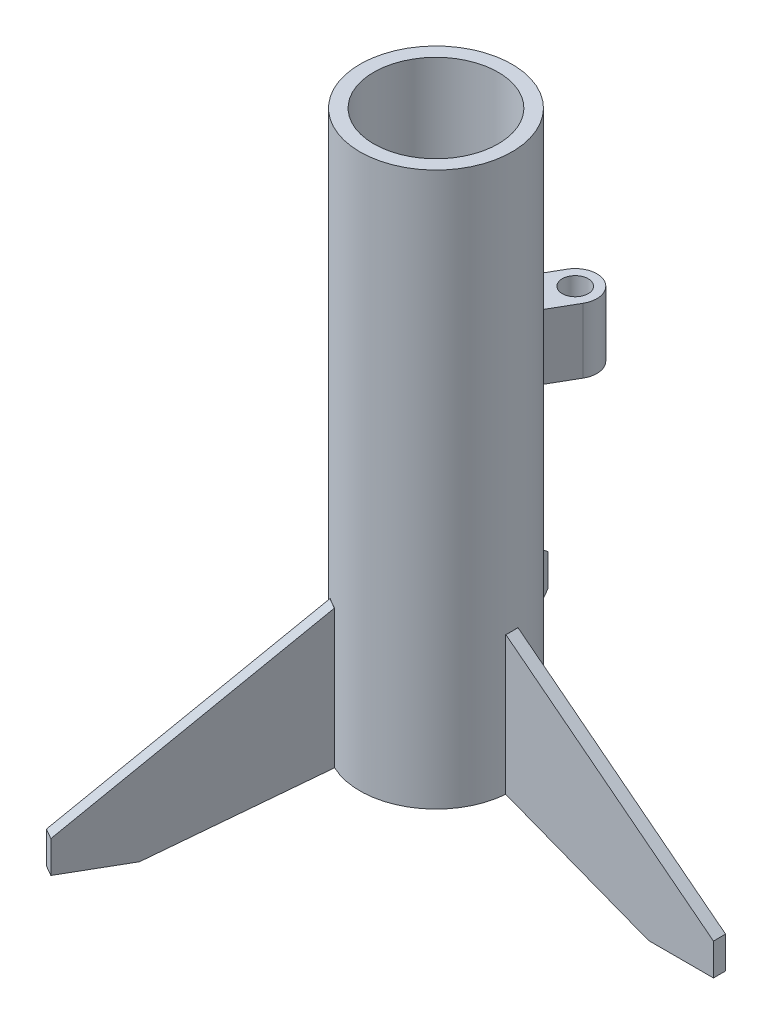
ISO-10303-21;
HEADER;
FILE_DESCRIPTION(('STEP AP214'),'2;1');
FILE_NAME('part.step','',(''),(''),'','','');
FILE_SCHEMA(('AUTOMOTIVE_DESIGN { 1 0 10303 214 1 1 1 1 }'));
ENDSEC;
DATA;
#1=APPLICATION_CONTEXT('core data for automotive mechanical design processes');
#2=APPLICATION_PROTOCOL_DEFINITION('international standard','automotive_design',2000,#1);
#3=PRODUCT_CONTEXT('',#1,'mechanical');
#4=PRODUCT('Part','Part','',(#3));
#5=PRODUCT_RELATED_PRODUCT_CATEGORY('part','',(#4));
#6=PRODUCT_DEFINITION_FORMATION('','',#4);
#7=PRODUCT_DEFINITION_CONTEXT('part definition',#1,'design');
#8=PRODUCT_DEFINITION('design','',#6,#7);
#9=PRODUCT_DEFINITION_SHAPE('','',#8);
#10=(LENGTH_UNIT() NAMED_UNIT(*) SI_UNIT(.MILLI.,.METRE.));
#11=(NAMED_UNIT(*) PLANE_ANGLE_UNIT() SI_UNIT($,.RADIAN.));
#12=(NAMED_UNIT(*) SI_UNIT($,.STERADIAN.) SOLID_ANGLE_UNIT());
#13=UNCERTAINTY_MEASURE_WITH_UNIT(LENGTH_MEASURE(1.E-05),#10,'distance_accuracy_value','');
#14=(GEOMETRIC_REPRESENTATION_CONTEXT(3) GLOBAL_UNCERTAINTY_ASSIGNED_CONTEXT((#13)) GLOBAL_UNIT_ASSIGNED_CONTEXT((#10,
#11,#12)) REPRESENTATION_CONTEXT('',''));
#15=CARTESIAN_POINT('',(0.,0.,0.));
#16=DIRECTION('',(0.,0.,1.));
#17=DIRECTION('',(1.,0.,0.));
#18=AXIS2_PLACEMENT_3D('',#15,#16,#17);
#19=CARTESIAN_POINT('',(0.,81.28,0.));
#20=DIRECTION('',(0.,-1.,0.));
#21=DIRECTION('',(0.,0.,-1.));
#22=AXIS2_PLACEMENT_3D('',#19,#20,#21);
#23=CYLINDRICAL_SURFACE('',#22,11.1633);
#24=DIRECTION('',(0.,-1.,0.));
#25=VECTOR('',#24,1.);
#26=CARTESIAN_POINT('',(-4.79402617542931,81.28,-10.0814969086589));
#27=LINE('',#26,#25);
#28=CARTESIAN_POINT('',(-4.79402617542931,20.32,-10.0814969086589));
#29=VERTEX_POINT('',#28);
#30=CARTESIAN_POINT('',(-4.79402617542932,0.,-10.0814969086589));
#31=VERTEX_POINT('',#30);
#32=EDGE_CURVE('E312',#29,#31,#27,.T.);
#33=ORIENTED_EDGE('',*,*,#32,.F.);
#34=CARTESIAN_POINT('',(0.,20.32,0.));
#35=DIRECTION('',(0.,-1.,0.));
#36=DIRECTION('',(0.,0.,-1.));
#37=AXIS2_PLACEMENT_3D('',#34,#35,#36);
#38=CIRCLE('',#37,11.1633);
#39=CARTESIAN_POINT('',(-5.58164999999991,20.32,-9.66770139006687));
#40=VERTEX_POINT('',#39);
#41=EDGE_CURVE('E306',#40,#29,#38,.T.);
#42=ORIENTED_EDGE('',*,*,#41,.F.);
#43=CARTESIAN_POINT('',(-6.33381934335805,20.32,-9.1924969086589));
#44=VERTEX_POINT('',#43);
#45=EDGE_CURVE('E308',#44,#40,#38,.T.);
#46=ORIENTED_EDGE('',*,*,#45,.F.);
#47=DIRECTION('',(0.,-1.,0.));
#48=VECTOR('',#47,1.);
#49=CARTESIAN_POINT('',(-6.33381934335805,81.28,-9.1924969086589));
#50=LINE('',#49,#48);
#51=CARTESIAN_POINT('',(-6.33381934335805,0.,-9.1924969086589));
#52=VERTEX_POINT('',#51);
#53=EDGE_CURVE('E309',#44,#52,#50,.T.);
#54=ORIENTED_EDGE('',*,*,#53,.T.);
#55=CARTESIAN_POINT('',(0.,0.,0.));
#56=DIRECTION('',(0.,1.,0.));
#57=DIRECTION('',(0.,0.,1.));
#58=AXIS2_PLACEMENT_3D('',#55,#56,#57);
#59=CIRCLE('',#58,11.1633);
#60=CARTESIAN_POINT('',(-6.33381934335818,0.,9.19249690865881));
#61=VERTEX_POINT('',#60);
#62=EDGE_CURVE('E430',#52,#61,#59,.T.);
#63=ORIENTED_EDGE('',*,*,#62,.T.);
#64=DIRECTION('',(0.,-1.,0.));
#65=VECTOR('',#64,1.);
#66=CARTESIAN_POINT('',(-6.33381934335818,81.28,9.19249690865881));
#67=LINE('',#66,#65);
#68=CARTESIAN_POINT('',(-6.33381934335818,20.32,9.19249690865881));
#69=VERTEX_POINT('',#68);
#70=EDGE_CURVE('E365',#69,#61,#67,.T.);
#71=ORIENTED_EDGE('',*,*,#70,.F.);
#72=CARTESIAN_POINT('',(0.,20.32,0.));
#73=DIRECTION('',(0.,-1.,0.));
#74=DIRECTION('',(0.,0.,-1.));
#75=AXIS2_PLACEMENT_3D('',#72,#73,#74);
#76=CIRCLE('',#75,11.1633);
#77=CARTESIAN_POINT('',(-5.58165000000005,20.32,9.6677013900668));
#78=VERTEX_POINT('',#77);
#79=EDGE_CURVE('E359',#78,#69,#76,.T.);
#80=ORIENTED_EDGE('',*,*,#79,.F.);
#81=CARTESIAN_POINT('',(-4.79402617542946,20.32,10.0814969086588));
#82=VERTEX_POINT('',#81);
#83=EDGE_CURVE('E361',#82,#78,#76,.T.);
#84=ORIENTED_EDGE('',*,*,#83,.F.);
#85=DIRECTION('',(0.,-1.,0.));
#86=VECTOR('',#85,1.);
#87=CARTESIAN_POINT('',(-4.79402617542946,81.28,10.0814969086588));
#88=LINE('',#87,#86);
#89=CARTESIAN_POINT('',(-4.79402617542945,0.,10.0814969086588));
#90=VERTEX_POINT('',#89);
#91=EDGE_CURVE('E362',#82,#90,#88,.T.);
#92=ORIENTED_EDGE('',*,*,#91,.T.);
#93=CARTESIAN_POINT('',(11.1278455187875,0.,0.889));
#94=VERTEX_POINT('',#93);
#95=EDGE_CURVE('E419',#90,#94,#59,.T.);
#96=ORIENTED_EDGE('',*,*,#95,.T.);
#97=DIRECTION('',(0.,-1.,0.));
#98=VECTOR('',#97,1.);
#99=CARTESIAN_POINT('',(11.1278455187875,81.28,0.889));
#100=LINE('',#99,#98);
#101=CARTESIAN_POINT('',(11.1278455187875,20.32,0.889));
#102=VERTEX_POINT('',#101);
#103=EDGE_CURVE('E44',#102,#94,#100,.T.);
#104=ORIENTED_EDGE('',*,*,#103,.F.);
#105=CARTESIAN_POINT('',(0.,20.32,0.));
#106=DIRECTION('',(0.,-1.,0.));
#107=DIRECTION('',(0.,0.,-1.));
#108=AXIS2_PLACEMENT_3D('',#105,#106,#107);
#109=CIRCLE('',#108,11.1633);
#110=CARTESIAN_POINT('',(11.1633,20.32,0.));
#111=VERTEX_POINT('',#110);
#112=EDGE_CURVE('E413',#111,#102,#109,.T.);
#113=ORIENTED_EDGE('',*,*,#112,.F.);
#114=CARTESIAN_POINT('',(11.1278455187875,20.32,-0.889));
#115=VERTEX_POINT('',#114);
#116=EDGE_CURVE('E415',#115,#111,#109,.T.);
#117=ORIENTED_EDGE('',*,*,#116,.F.);
#118=DIRECTION('',(0.,-1.,0.));
#119=VECTOR('',#118,1.);
#120=CARTESIAN_POINT('',(11.1278455187875,81.28,-0.889));
#121=LINE('',#120,#119);
#122=CARTESIAN_POINT('',(11.1278455187875,0.,-0.889));
#123=VERTEX_POINT('',#122);
#124=EDGE_CURVE('E426',#115,#123,#121,.T.);
#125=ORIENTED_EDGE('',*,*,#124,.T.);
#126=EDGE_CURVE('E427',#123,#31,#59,.T.);
#127=ORIENTED_EDGE('',*,*,#126,.T.);
#128=EDGE_LOOP('',(#33,#42,#46,#54,#63,#71,#80,#84,#92,#96,#104,#113,#117,#125,#127));
#129=FACE_BOUND('',#128,.T.);
#130=CARTESIAN_POINT('',(0.,81.28,0.));
#131=DIRECTION('',(0.,1.,0.));
#132=DIRECTION('',(0.,0.,1.));
#133=AXIS2_PLACEMENT_3D('',#130,#131,#132);
#134=CIRCLE('',#133,11.1633);
#135=CARTESIAN_POINT('',(0.,81.28,11.1633));
#136=VERTEX_POINT('',#135);
#137=EDGE_CURVE('E423',#136,#136,#134,.T.);
#138=ORIENTED_EDGE('',*,*,#137,.F.);
#139=EDGE_LOOP('',(#138));
#140=FACE_BOUND('',#139,.T.);
#141=CARTESIAN_POINT('',(0.,46.355,0.));
#142=DIRECTION('',(0.,-1.,0.));
#143=DIRECTION('',(0.,0.,-1.));
#144=AXIS2_PLACEMENT_3D('',#141,#142,#143);
#145=CIRCLE('',#144,11.1633);
#146=CARTESIAN_POINT('',(8.10076702908649,46.355,-7.68094007465657));
#147=VERTEX_POINT('',#146);
#148=CARTESIAN_POINT('',(2.60150571505531,46.355,-10.8559400746566));
#149=VERTEX_POINT('',#148);
#150=EDGE_CURVE('E218',#147,#149,#145,.F.);
#151=ORIENTED_EDGE('',*,*,#150,.F.);
#152=DIRECTION('',(0.,-1.,0.));
#153=VECTOR('',#152,1.);
#154=CARTESIAN_POINT('',(8.10076702908649,81.28,-7.68094007465657));
#155=LINE('',#154,#153);
#156=CARTESIAN_POINT('',(8.10076702908649,55.88,-7.68094007465657));
#157=VERTEX_POINT('',#156);
#158=EDGE_CURVE('E233',#157,#147,#155,.T.);
#159=ORIENTED_EDGE('',*,*,#158,.F.);
#160=CARTESIAN_POINT('',(0.,55.88,0.));
#161=DIRECTION('',(0.,1.,0.));
#162=DIRECTION('',(0.,0.,1.));
#163=AXIS2_PLACEMENT_3D('',#160,#161,#162);
#164=CIRCLE('',#163,11.1633);
#165=CARTESIAN_POINT('',(2.60150571505531,55.88,-10.8559400746566));
#166=VERTEX_POINT('',#165);
#167=EDGE_CURVE('E56',#166,#157,#164,.F.);
#168=ORIENTED_EDGE('',*,*,#167,.F.);
#169=DIRECTION('',(0.,-1.,0.));
#170=VECTOR('',#169,1.);
#171=CARTESIAN_POINT('',(2.60150571505531,81.28,-10.8559400746566));
#172=LINE('',#171,#170);
#173=EDGE_CURVE('E51',#149,#166,#172,.F.);
#174=ORIENTED_EDGE('',*,*,#173,.F.);
#175=EDGE_LOOP('',(#151,#159,#168,#174));
#176=FACE_BOUND('',#175,.T.);
#177=ADVANCED_FACE('F37',(#129,#140,#176),#23,.T.);
#178=CARTESIAN_POINT('',(0.,81.28,0.));
#179=DIRECTION('',(0.,-1.,0.));
#180=DIRECTION('',(0.,0.,-1.));
#181=AXIS2_PLACEMENT_3D('',#178,#179,#180);
#182=CYLINDRICAL_SURFACE('',#181,9.1313);
#183=CARTESIAN_POINT('',(0.,0.,0.));
#184=DIRECTION('',(0.,1.,0.));
#185=DIRECTION('',(0.,0.,1.));
#186=AXIS2_PLACEMENT_3D('',#183,#184,#185);
#187=CIRCLE('',#186,9.1313);
#188=CARTESIAN_POINT('',(0.,0.,9.1313));
#189=VERTEX_POINT('',#188);
#190=EDGE_CURVE('E420',#189,#189,#187,.T.);
#191=ORIENTED_EDGE('',*,*,#190,.F.);
#192=EDGE_LOOP('',(#191));
#193=FACE_BOUND('',#192,.T.);
#194=CARTESIAN_POINT('',(0.,63.5,0.));
#195=DIRECTION('',(0.,1.,0.));
#196=DIRECTION('',(0.,0.,1.));
#197=AXIS2_PLACEMENT_3D('',#194,#195,#196);
#198=CIRCLE('',#197,9.1313);
#199=CARTESIAN_POINT('',(0.,63.5,9.1313));
#200=VERTEX_POINT('',#199);
#201=EDGE_CURVE('E256',#200,#200,#198,.T.);
#202=ORIENTED_EDGE('',*,*,#201,.T.);
#203=EDGE_LOOP('',(#202));
#204=FACE_BOUND('',#203,.T.);
#205=ADVANCED_FACE('F484',(#193,#204),#182,.F.);
#206=CARTESIAN_POINT('',(0.,81.28,0.));
#207=DIRECTION('',(0.,1.,0.));
#208=DIRECTION('',(0.,0.,1.));
#209=AXIS2_PLACEMENT_3D('',#206,#207,#208);
#210=PLANE('',#209);
#211=ORIENTED_EDGE('',*,*,#137,.T.);
#212=EDGE_LOOP('',(#211));
#213=FACE_BOUND('',#212,.T.);
#214=CARTESIAN_POINT('',(0.,81.28,0.));
#215=DIRECTION('',(0.,1.,0.));
#216=DIRECTION('',(0.,0.,1.));
#217=AXIS2_PLACEMENT_3D('',#214,#215,#216);
#218=CIRCLE('',#217,9.1313);
#219=CARTESIAN_POINT('',(0.,81.28,9.1313));
#220=VERTEX_POINT('',#219);
#221=EDGE_CURVE('E416',#220,#220,#218,.T.);
#222=ORIENTED_EDGE('',*,*,#221,.F.);
#223=EDGE_LOOP('',(#222));
#224=FACE_BOUND('',#223,.T.);
#225=ADVANCED_FACE('F488',(#213,#224),#210,.T.);
#226=CARTESIAN_POINT('',(0.,0.,0.));
#227=DIRECTION('',(0.,1.,0.));
#228=DIRECTION('',(0.,0.,1.));
#229=AXIS2_PLACEMENT_3D('',#226,#227,#228);
#230=PLANE('',#229);
#231=ORIENTED_EDGE('',*,*,#190,.T.);
#232=EDGE_LOOP('',(#231));
#233=FACE_BOUND('',#232,.T.);
#234=DIRECTION('',(-0.499999999999992,0.,-0.866025403784443));
#235=VECTOR('',#234,1.);
#236=CARTESIAN_POINT('',(-6.35154658396428,0.,-9.22320139006688));
#237=LINE('',#236,#235);
#238=CARTESIAN_POINT('',(-6.35154658396428,0.,-9.22320139006688));
#239=VERTEX_POINT('',#238);
#240=EDGE_CURVE('E266',#52,#239,#237,.T.);
#241=ORIENTED_EDGE('',*,*,#240,.T.);
#242=DIRECTION('',(-0.866025403784443,0.,0.499999999999992));
#243=VECTOR('',#242,1.);
#244=CARTESIAN_POINT('',(-4.81175341603554,0.,-10.1122013900669));
#245=LINE('',#244,#243);
#246=CARTESIAN_POINT('',(-4.81175341603554,0.,-10.1122013900669));
#247=VERTEX_POINT('',#246);
#248=EDGE_CURVE('E277',#247,#239,#245,.T.);
#249=ORIENTED_EDGE('',*,*,#248,.F.);
#250=DIRECTION('',(-0.499999999999992,0.,-0.866025403784443));
#251=VECTOR('',#250,1.);
#252=CARTESIAN_POINT('',(-4.81175341603554,0.,-10.1122013900669));
#253=LINE('',#252,#251);
#254=EDGE_CURVE('E275',#31,#247,#253,.T.);
#255=ORIENTED_EDGE('',*,*,#254,.F.);
#256=ORIENTED_EDGE('',*,*,#126,.F.);
#257=DIRECTION('',(1.,0.,0.));
#258=VECTOR('',#257,1.);
#259=CARTESIAN_POINT('',(11.1633,0.,-0.889));
#260=LINE('',#259,#258);
#261=CARTESIAN_POINT('',(11.1633,0.,-0.889));
#262=VERTEX_POINT('',#261);
#263=EDGE_CURVE('E373',#123,#262,#260,.T.);
#264=ORIENTED_EDGE('',*,*,#263,.T.);
#265=DIRECTION('',(0.,0.,-1.));
#266=VECTOR('',#265,1.);
#267=CARTESIAN_POINT('',(11.1633,0.,0.889));
#268=LINE('',#267,#266);
#269=CARTESIAN_POINT('',(11.1633,0.,0.889));
#270=VERTEX_POINT('',#269);
#271=EDGE_CURVE('E384',#270,#262,#268,.T.);
#272=ORIENTED_EDGE('',*,*,#271,.F.);
#273=DIRECTION('',(1.,0.,0.));
#274=VECTOR('',#273,1.);
#275=CARTESIAN_POINT('',(11.1633,0.,0.889));
#276=LINE('',#275,#274);
#277=EDGE_CURVE('E382',#94,#270,#276,.T.);
#278=ORIENTED_EDGE('',*,*,#277,.F.);
#279=ORIENTED_EDGE('',*,*,#95,.F.);
#280=DIRECTION('',(-0.500000000000004,0.,0.866025403784436));
#281=VECTOR('',#280,1.);
#282=CARTESIAN_POINT('',(-4.81175341603568,0.,10.1122013900668));
#283=LINE('',#282,#281);
#284=CARTESIAN_POINT('',(-4.81175341603568,0.,10.1122013900668));
#285=VERTEX_POINT('',#284);
#286=EDGE_CURVE('E319',#90,#285,#283,.T.);
#287=ORIENTED_EDGE('',*,*,#286,.T.);
#288=DIRECTION('',(0.866025403784436,0.,0.500000000000004));
#289=VECTOR('',#288,1.);
#290=CARTESIAN_POINT('',(-6.35154658396441,0.,9.2232013900668));
#291=LINE('',#290,#289);
#292=CARTESIAN_POINT('',(-6.35154658396441,0.,9.2232013900668));
#293=VERTEX_POINT('',#292);
#294=EDGE_CURVE('E330',#293,#285,#291,.T.);
#295=ORIENTED_EDGE('',*,*,#294,.F.);
#296=DIRECTION('',(-0.500000000000004,0.,0.866025403784436));
#297=VECTOR('',#296,1.);
#298=CARTESIAN_POINT('',(-6.35154658396441,0.,9.2232013900668));
#299=LINE('',#298,#297);
#300=EDGE_CURVE('E328',#61,#293,#299,.T.);
#301=ORIENTED_EDGE('',*,*,#300,.F.);
#302=ORIENTED_EDGE('',*,*,#62,.F.);
#303=EDGE_LOOP('',(#241,#249,#255,#256,#264,#272,#278,#279,#287,#295,#301,#302));
#304=FACE_BOUND('',#303,.T.);
#305=ADVANCED_FACE('F443',(#233,#304),#230,.F.);
#306=CARTESIAN_POINT('',(0.,66.675,0.));
#307=DIRECTION('',(0.,1.,0.));
#308=DIRECTION('',(0.,0.,1.));
#309=AXIS2_PLACEMENT_3D('',#306,#307,#308);
#310=CIRCLE('',#309,9.1313);
#311=CARTESIAN_POINT('',(0.,66.675,9.1313));
#312=VERTEX_POINT('',#311);
#313=EDGE_CURVE('E11',#312,#312,#310,.T.);
#314=ORIENTED_EDGE('',*,*,#313,.F.);
#315=EDGE_LOOP('',(#314));
#316=FACE_BOUND('',#315,.T.);
#317=ORIENTED_EDGE('',*,*,#221,.T.);
#318=EDGE_LOOP('',(#317));
#319=FACE_BOUND('',#318,.T.);
#320=ADVANCED_FACE('F481',(#316,#319),#182,.F.);
#321=CARTESIAN_POINT('',(0.,0.,0.889));
#322=DIRECTION('',(0.,0.,-1.));
#323=DIRECTION('',(-1.,0.,0.));
#324=AXIS2_PLACEMENT_3D('',#321,#322,#323);
#325=PLANE('',#324);
#326=DIRECTION('',(-1.,0.,0.));
#327=VECTOR('',#326,1.);
#328=CARTESIAN_POINT('',(9.1313,20.32,0.889));
#329=LINE('',#328,#327);
#330=CARTESIAN_POINT('',(11.1633,20.32,0.889));
#331=VERTEX_POINT('',#330);
#332=EDGE_CURVE('E379',#331,#102,#329,.T.);
#333=ORIENTED_EDGE('',*,*,#332,.T.);
#334=ORIENTED_EDGE('',*,*,#103,.T.);
#335=ORIENTED_EDGE('',*,*,#277,.T.);
#336=DIRECTION('',(0.932693720176454,-0.360669411432972,0.));
#337=VECTOR('',#336,1.);
#338=CARTESIAN_POINT('',(32.1183,-8.1032254780788,0.889));
#339=LINE('',#338,#337);
#340=CARTESIAN_POINT('',(32.1183,-8.1032254780788,0.889));
#341=VERTEX_POINT('',#340);
#342=EDGE_CURVE('E369',#270,#341,#339,.T.);
#343=ORIENTED_EDGE('',*,*,#342,.T.);
#344=DIRECTION('',(1.,0.,0.));
#345=VECTOR('',#344,1.);
#346=CARTESIAN_POINT('',(32.1183,-8.1032254780788,0.889));
#347=LINE('',#346,#345);
#348=CARTESIAN_POINT('',(41.6433,-8.1032254780788,0.889));
#349=VERTEX_POINT('',#348);
#350=EDGE_CURVE('E372',#341,#349,#347,.T.);
#351=ORIENTED_EDGE('',*,*,#350,.T.);
#352=DIRECTION('',(0.,1.,0.));
#353=VECTOR('',#352,1.);
#354=CARTESIAN_POINT('',(41.6433,-3.40803261256807,0.889));
#355=LINE('',#354,#353);
#356=CARTESIAN_POINT('',(41.6433,-3.40803261256807,0.889));
#357=VERTEX_POINT('',#356);
#358=EDGE_CURVE('E375',#349,#357,#355,.T.);
#359=ORIENTED_EDGE('',*,*,#358,.T.);
#360=DIRECTION('',(-0.789084084834688,0.614285200098947,0.));
#361=VECTOR('',#360,1.);
#362=CARTESIAN_POINT('',(11.1633,20.32,0.889));
#363=LINE('',#362,#361);
#364=EDGE_CURVE('E377',#357,#331,#363,.T.);
#365=ORIENTED_EDGE('',*,*,#364,.T.);
#366=EDGE_LOOP('',(#333,#334,#335,#343,#351,#359,#365));
#367=FACE_BOUND('',#366,.T.);
#368=ADVANCED_FACE('F436',(#367),#325,.F.);
#369=CARTESIAN_POINT('',(0.,0.,-0.889));
#370=DIRECTION('',(0.,0.,-1.));
#371=DIRECTION('',(-1.,0.,0.));
#372=AXIS2_PLACEMENT_3D('',#369,#370,#371);
#373=PLANE('',#372);
#374=ORIENTED_EDGE('',*,*,#124,.F.);
#375=DIRECTION('',(-1.,0.,0.));
#376=VECTOR('',#375,1.);
#377=CARTESIAN_POINT('',(9.1313,20.32,-0.889));
#378=LINE('',#377,#376);
#379=CARTESIAN_POINT('',(11.1633,20.32,-0.889));
#380=VERTEX_POINT('',#379);
#381=EDGE_CURVE('E394',#380,#115,#378,.T.);
#382=ORIENTED_EDGE('',*,*,#381,.F.);
#383=DIRECTION('',(-0.789084084834688,0.614285200098947,0.));
#384=VECTOR('',#383,1.);
#385=CARTESIAN_POINT('',(11.1633,20.32,-0.889));
#386=LINE('',#385,#384);
#387=CARTESIAN_POINT('',(41.6433,-3.40803261256807,-0.889));
#388=VERTEX_POINT('',#387);
#389=EDGE_CURVE('E391',#388,#380,#386,.T.);
#390=ORIENTED_EDGE('',*,*,#389,.F.);
#391=DIRECTION('',(0.,1.,0.));
#392=VECTOR('',#391,1.);
#393=CARTESIAN_POINT('',(41.6433,-3.40803261256807,-0.889));
#394=LINE('',#393,#392);
#395=CARTESIAN_POINT('',(41.6433,-8.1032254780788,-0.889));
#396=VERTEX_POINT('',#395);
#397=EDGE_CURVE('E389',#396,#388,#394,.T.);
#398=ORIENTED_EDGE('',*,*,#397,.F.);
#399=DIRECTION('',(1.,0.,0.));
#400=VECTOR('',#399,1.);
#401=CARTESIAN_POINT('',(32.1183,-8.1032254780788,-0.889));
#402=LINE('',#401,#400);
#403=CARTESIAN_POINT('',(32.1183,-8.1032254780788,-0.889));
#404=VERTEX_POINT('',#403);
#405=EDGE_CURVE('E387',#404,#396,#402,.T.);
#406=ORIENTED_EDGE('',*,*,#405,.F.);
#407=DIRECTION('',(0.932693720176454,-0.360669411432972,0.));
#408=VECTOR('',#407,1.);
#409=CARTESIAN_POINT('',(32.1183,-8.1032254780788,-0.889));
#410=LINE('',#409,#408);
#411=EDGE_CURVE('E368',#262,#404,#410,.T.);
#412=ORIENTED_EDGE('',*,*,#411,.F.);
#413=ORIENTED_EDGE('',*,*,#263,.F.);
#414=EDGE_LOOP('',(#374,#382,#390,#398,#406,#412,#413));
#415=FACE_BOUND('',#414,.T.);
#416=ADVANCED_FACE('F473',(#415),#373,.T.);
#417=CARTESIAN_POINT('',(9.1313,20.32,0.889));
#418=DIRECTION('',(0.,-1.,0.));
#419=DIRECTION('',(0.,0.,-1.));
#420=AXIS2_PLACEMENT_3D('',#417,#418,#419);
#421=PLANE('',#420);
#422=ORIENTED_EDGE('',*,*,#381,.T.);
#423=ORIENTED_EDGE('',*,*,#116,.T.);
#424=DIRECTION('',(0.,0.,-1.));
#425=VECTOR('',#424,1.);
#426=CARTESIAN_POINT('',(11.1633,20.32,0.889));
#427=LINE('',#426,#425);
#428=EDGE_CURVE('E400',#111,#380,#427,.T.);
#429=ORIENTED_EDGE('',*,*,#428,.T.);
#430=EDGE_LOOP('',(#422,#423,#429));
#431=FACE_BOUND('',#430,.T.);
#432=ADVANCED_FACE('F470',(#431),#421,.F.);
#433=CARTESIAN_POINT('',(32.1183,-8.1032254780788,0.889));
#434=DIRECTION('',(0.360669411432972,0.932693720176454,0.));
#435=DIRECTION('',(-0.932693720176454,0.360669411432972,0.));
#436=AXIS2_PLACEMENT_3D('',#433,#434,#435);
#437=PLANE('',#436);
#438=ORIENTED_EDGE('',*,*,#411,.T.);
#439=DIRECTION('',(0.,0.,-1.));
#440=VECTOR('',#439,1.);
#441=CARTESIAN_POINT('',(32.1183,-8.1032254780788,0.889));
#442=LINE('',#441,#440);
#443=EDGE_CURVE('E410',#341,#404,#442,.T.);
#444=ORIENTED_EDGE('',*,*,#443,.F.);
#445=ORIENTED_EDGE('',*,*,#342,.F.);
#446=ORIENTED_EDGE('',*,*,#271,.T.);
#447=EDGE_LOOP('',(#438,#444,#445,#446));
#448=FACE_BOUND('',#447,.T.);
#449=ADVANCED_FACE('F449',(#448),#437,.F.);
#450=CARTESIAN_POINT('',(32.1183,-8.1032254780788,0.889));
#451=DIRECTION('',(0.,1.,0.));
#452=DIRECTION('',(0.,0.,1.));
#453=AXIS2_PLACEMENT_3D('',#450,#451,#452);
#454=PLANE('',#453);
#455=ORIENTED_EDGE('',*,*,#405,.T.);
#456=DIRECTION('',(0.,0.,-1.));
#457=VECTOR('',#456,1.);
#458=CARTESIAN_POINT('',(41.6433,-8.1032254780788,0.889));
#459=LINE('',#458,#457);
#460=EDGE_CURVE('E407',#349,#396,#459,.T.);
#461=ORIENTED_EDGE('',*,*,#460,.F.);
#462=ORIENTED_EDGE('',*,*,#350,.F.);
#463=ORIENTED_EDGE('',*,*,#443,.T.);
#464=EDGE_LOOP('',(#455,#461,#462,#463));
#465=FACE_BOUND('',#464,.T.);
#466=ADVANCED_FACE('F454',(#465),#454,.F.);
#467=CARTESIAN_POINT('',(41.6433,-3.40803261256807,0.889));
#468=DIRECTION('',(-1.,0.,0.));
#469=DIRECTION('',(0.,-1.,0.));
#470=AXIS2_PLACEMENT_3D('',#467,#468,#469);
#471=PLANE('',#470);
#472=ORIENTED_EDGE('',*,*,#397,.T.);
#473=DIRECTION('',(0.,0.,-1.));
#474=VECTOR('',#473,1.);
#475=CARTESIAN_POINT('',(41.6433,-3.40803261256807,0.889));
#476=LINE('',#475,#474);
#477=EDGE_CURVE('E404',#357,#388,#476,.T.);
#478=ORIENTED_EDGE('',*,*,#477,.F.);
#479=ORIENTED_EDGE('',*,*,#358,.F.);
#480=ORIENTED_EDGE('',*,*,#460,.T.);
#481=EDGE_LOOP('',(#472,#478,#479,#480));
#482=FACE_BOUND('',#481,.T.);
#483=ADVANCED_FACE('F457',(#482),#471,.F.);
#484=CARTESIAN_POINT('',(11.1633,20.32,0.889));
#485=DIRECTION('',(-0.614285200098947,-0.789084084834688,0.));
#486=DIRECTION('',(0.789084084834688,-0.614285200098947,0.));
#487=AXIS2_PLACEMENT_3D('',#484,#485,#486);
#488=PLANE('',#487);
#489=ORIENTED_EDGE('',*,*,#389,.T.);
#490=ORIENTED_EDGE('',*,*,#428,.F.);
#491=EDGE_CURVE('E401',#331,#111,#427,.T.);
#492=ORIENTED_EDGE('',*,*,#491,.F.);
#493=ORIENTED_EDGE('',*,*,#364,.F.);
#494=ORIENTED_EDGE('',*,*,#477,.T.);
#495=EDGE_LOOP('',(#489,#490,#492,#493,#494));
#496=FACE_BOUND('',#495,.T.);
#497=ADVANCED_FACE('F462',(#496),#488,.F.);
#498=ORIENTED_EDGE('',*,*,#491,.T.);
#499=ORIENTED_EDGE('',*,*,#112,.T.);
#500=ORIENTED_EDGE('',*,*,#332,.F.);
#501=EDGE_LOOP('',(#498,#499,#500));
#502=FACE_BOUND('',#501,.T.);
#503=ADVANCED_FACE('F465',(#502),#421,.F.);
#504=CARTESIAN_POINT('',(-0.769896583964364,0.,-0.444500000000004));
#505=DIRECTION('',(0.866025403784436,0.,0.500000000000004));
#506=DIRECTION('',(0.500000000000004,0.,-0.866025403784436));
#507=AXIS2_PLACEMENT_3D('',#504,#505,#506);
#508=PLANE('',#507);
#509=DIRECTION('',(0.500000000000004,0.,-0.866025403784436));
#510=VECTOR('',#509,1.);
#511=CARTESIAN_POINT('',(-5.3355465839644,20.32,7.46343776957682));
#512=LINE('',#511,#510);
#513=CARTESIAN_POINT('',(-6.35154658396441,20.32,9.2232013900668));
#514=VERTEX_POINT('',#513);
#515=EDGE_CURVE('E325',#514,#69,#512,.T.);
#516=ORIENTED_EDGE('',*,*,#515,.T.);
#517=ORIENTED_EDGE('',*,*,#70,.T.);
#518=ORIENTED_EDGE('',*,*,#300,.T.);
#519=DIRECTION('',(-0.466346860088231,-0.360669411432972,0.807736455623022));
#520=VECTOR('',#519,1.);
#521=CARTESIAN_POINT('',(-16.8290465839645,-8.1032254780788,27.3707637263697));
#522=LINE('',#521,#520);
#523=CARTESIAN_POINT('',(-16.8290465839645,-8.1032254780788,27.3707637263697));
#524=VERTEX_POINT('',#523);
#525=EDGE_CURVE('E315',#293,#524,#522,.T.);
#526=ORIENTED_EDGE('',*,*,#525,.T.);
#527=DIRECTION('',(-0.500000000000004,0.,0.866025403784436));
#528=VECTOR('',#527,1.);
#529=CARTESIAN_POINT('',(-16.8290465839645,-8.1032254780788,27.3707637263697));
#530=LINE('',#529,#528);
#531=CARTESIAN_POINT('',(-21.5915465839645,-8.1032254780788,35.6196556974164));
#532=VERTEX_POINT('',#531);
#533=EDGE_CURVE('E318',#524,#532,#530,.T.);
#534=ORIENTED_EDGE('',*,*,#533,.T.);
#535=DIRECTION('',(0.,1.,0.));
#536=VECTOR('',#535,1.);
#537=CARTESIAN_POINT('',(-21.5915465839645,-3.40803261256807,35.6196556974164));
#538=LINE('',#537,#536);
#539=CARTESIAN_POINT('',(-21.5915465839645,-3.40803261256807,35.6196556974164));
#540=VERTEX_POINT('',#539);
#541=EDGE_CURVE('E321',#532,#540,#538,.T.);
#542=ORIENTED_EDGE('',*,*,#541,.T.);
#543=DIRECTION('',(0.394542042417347,0.614285200098947,-0.683366863188833));
#544=VECTOR('',#543,1.);
#545=CARTESIAN_POINT('',(-6.35154658396441,20.32,9.2232013900668));
#546=LINE('',#545,#544);
#547=EDGE_CURVE('E323',#540,#514,#546,.T.);
#548=ORIENTED_EDGE('',*,*,#547,.T.);
#549=EDGE_LOOP('',(#516,#517,#518,#526,#534,#542,#548));
#550=FACE_BOUND('',#549,.T.);
#551=ADVANCED_FACE('F560',(#550),#508,.F.);
#552=CARTESIAN_POINT('',(0.769896583964364,0.,0.444500000000004));
#553=DIRECTION('',(0.866025403784436,0.,0.500000000000004));
#554=DIRECTION('',(0.500000000000004,0.,-0.866025403784436));
#555=AXIS2_PLACEMENT_3D('',#552,#553,#554);
#556=PLANE('',#555);
#557=ORIENTED_EDGE('',*,*,#91,.F.);
#558=DIRECTION('',(0.500000000000004,0.,-0.866025403784436));
#559=VECTOR('',#558,1.);
#560=CARTESIAN_POINT('',(-3.79575341603567,20.32,8.35243776957683));
#561=LINE('',#560,#559);
#562=CARTESIAN_POINT('',(-4.81175341603568,20.32,10.1122013900668));
#563=VERTEX_POINT('',#562);
#564=EDGE_CURVE('E340',#563,#82,#561,.T.);
#565=ORIENTED_EDGE('',*,*,#564,.F.);
#566=DIRECTION('',(0.394542042417347,0.614285200098947,-0.683366863188833));
#567=VECTOR('',#566,1.);
#568=CARTESIAN_POINT('',(-4.81175341603568,20.32,10.1122013900668));
#569=LINE('',#568,#567);
#570=CARTESIAN_POINT('',(-20.0517534160358,-3.40803261256807,36.5086556974164));
#571=VERTEX_POINT('',#570);
#572=EDGE_CURVE('E337',#571,#563,#569,.T.);
#573=ORIENTED_EDGE('',*,*,#572,.F.);
#574=DIRECTION('',(0.,1.,0.));
#575=VECTOR('',#574,1.);
#576=CARTESIAN_POINT('',(-20.0517534160358,-3.40803261256807,36.5086556974164));
#577=LINE('',#576,#575);
#578=CARTESIAN_POINT('',(-20.0517534160358,-8.1032254780788,36.5086556974164));
#579=VERTEX_POINT('',#578);
#580=EDGE_CURVE('E335',#579,#571,#577,.T.);
#581=ORIENTED_EDGE('',*,*,#580,.F.);
#582=DIRECTION('',(-0.500000000000004,0.,0.866025403784436));
#583=VECTOR('',#582,1.);
#584=CARTESIAN_POINT('',(-15.2892534160358,-8.1032254780788,28.2597637263697));
#585=LINE('',#584,#583);
#586=CARTESIAN_POINT('',(-15.2892534160358,-8.1032254780788,28.2597637263697));
#587=VERTEX_POINT('',#586);
#588=EDGE_CURVE('E333',#587,#579,#585,.T.);
#589=ORIENTED_EDGE('',*,*,#588,.F.);
#590=DIRECTION('',(-0.466346860088231,-0.360669411432972,0.807736455623022));
#591=VECTOR('',#590,1.);
#592=CARTESIAN_POINT('',(-15.2892534160358,-8.1032254780788,28.2597637263697));
#593=LINE('',#592,#591);
#594=EDGE_CURVE('E314',#285,#587,#593,.T.);
#595=ORIENTED_EDGE('',*,*,#594,.F.);
#596=ORIENTED_EDGE('',*,*,#286,.F.);
#597=EDGE_LOOP('',(#557,#565,#573,#581,#589,#595,#596));
#598=FACE_BOUND('',#597,.T.);
#599=ADVANCED_FACE('F563',(#598),#556,.T.);
#600=CARTESIAN_POINT('',(-5.3355465839644,20.32,7.46343776957682));
#601=DIRECTION('',(0.,-1.,0.));
#602=DIRECTION('',(0.,0.,-1.));
#603=AXIS2_PLACEMENT_3D('',#600,#601,#602);
#604=PLANE('',#603);
#605=ORIENTED_EDGE('',*,*,#564,.T.);
#606=ORIENTED_EDGE('',*,*,#83,.T.);
#607=DIRECTION('',(0.866025403784436,0.,0.500000000000004));
#608=VECTOR('',#607,1.);
#609=CARTESIAN_POINT('',(-6.35154658396441,20.32,9.2232013900668));
#610=LINE('',#609,#608);
#611=EDGE_CURVE('E346',#78,#563,#610,.T.);
#612=ORIENTED_EDGE('',*,*,#611,.T.);
#613=EDGE_LOOP('',(#605,#606,#612));
#614=FACE_BOUND('',#613,.T.);
#615=ADVANCED_FACE('F567',(#614),#604,.F.);
#616=CARTESIAN_POINT('',(-16.8290465839645,-8.1032254780788,27.3707637263697));
#617=DIRECTION('',(-0.180334705716488,0.932693720176454,0.312348872668935));
#618=DIRECTION('',(0.,-0.317555091886718,0.9482398238931));
#619=AXIS2_PLACEMENT_3D('',#616,#617,#618);
#620=PLANE('',#619);
#621=ORIENTED_EDGE('',*,*,#594,.T.);
#622=DIRECTION('',(0.866025403784436,0.,0.500000000000004));
#623=VECTOR('',#622,1.);
#624=CARTESIAN_POINT('',(-16.8290465839645,-8.1032254780788,27.3707637263697));
#625=LINE('',#624,#623);
#626=EDGE_CURVE('E356',#524,#587,#625,.T.);
#627=ORIENTED_EDGE('',*,*,#626,.F.);
#628=ORIENTED_EDGE('',*,*,#525,.F.);
#629=ORIENTED_EDGE('',*,*,#294,.T.);
#630=EDGE_LOOP('',(#621,#627,#628,#629));
#631=FACE_BOUND('',#630,.T.);
#632=ADVANCED_FACE('F583',(#631),#620,.F.);
#633=CARTESIAN_POINT('',(-16.8290465839645,-8.1032254780788,27.3707637263697));
#634=DIRECTION('',(0.,1.,0.));
#635=DIRECTION('',(0.,0.,1.));
#636=AXIS2_PLACEMENT_3D('',#633,#634,#635);
#637=PLANE('',#636);
#638=ORIENTED_EDGE('',*,*,#588,.T.);
#639=DIRECTION('',(0.866025403784436,0.,0.500000000000004));
#640=VECTOR('',#639,1.);
#641=CARTESIAN_POINT('',(-21.5915465839645,-8.1032254780788,35.6196556974164));
#642=LINE('',#641,#640);
#643=EDGE_CURVE('E353',#532,#579,#642,.T.);
#644=ORIENTED_EDGE('',*,*,#643,.F.);
#645=ORIENTED_EDGE('',*,*,#533,.F.);
#646=ORIENTED_EDGE('',*,*,#626,.T.);
#647=EDGE_LOOP('',(#638,#644,#645,#646));
#648=FACE_BOUND('',#647,.T.);
#649=ADVANCED_FACE('F579',(#648),#637,.F.);
#650=CARTESIAN_POINT('',(-21.5915465839645,-3.40803261256807,35.6196556974164));
#651=DIRECTION('',(0.500000000000004,0.,-0.866025403784436));
#652=DIRECTION('',(-0.866025403784436,0.,-0.500000000000004));
#653=AXIS2_PLACEMENT_3D('',#650,#651,#652);
#654=PLANE('',#653);
#655=ORIENTED_EDGE('',*,*,#580,.T.);
#656=DIRECTION('',(0.866025403784436,0.,0.500000000000004));
#657=VECTOR('',#656,1.);
#658=CARTESIAN_POINT('',(-21.5915465839645,-3.40803261256807,35.6196556974164));
#659=LINE('',#658,#657);
#660=EDGE_CURVE('E350',#540,#571,#659,.T.);
#661=ORIENTED_EDGE('',*,*,#660,.F.);
#662=ORIENTED_EDGE('',*,*,#541,.F.);
#663=ORIENTED_EDGE('',*,*,#643,.T.);
#664=EDGE_LOOP('',(#655,#661,#662,#663));
#665=FACE_BOUND('',#664,.T.);
#666=ADVANCED_FACE('F575',(#665),#654,.F.);
#667=CARTESIAN_POINT('',(-6.35154658396441,20.32,9.2232013900668));
#668=DIRECTION('',(0.307142600049476,-0.789084084834688,-0.531986588454494));
#669=DIRECTION('',(0.,0.55900702999698,-0.829162915484017));
#670=AXIS2_PLACEMENT_3D('',#667,#668,#669);
#671=PLANE('',#670);
#672=ORIENTED_EDGE('',*,*,#572,.T.);
#673=ORIENTED_EDGE('',*,*,#611,.F.);
#674=EDGE_CURVE('E347',#514,#78,#610,.T.);
#675=ORIENTED_EDGE('',*,*,#674,.F.);
#676=ORIENTED_EDGE('',*,*,#547,.F.);
#677=ORIENTED_EDGE('',*,*,#660,.T.);
#678=EDGE_LOOP('',(#672,#673,#675,#676,#677));
#679=FACE_BOUND('',#678,.T.);
#680=ADVANCED_FACE('F571',(#679),#671,.F.);
#681=ORIENTED_EDGE('',*,*,#674,.T.);
#682=ORIENTED_EDGE('',*,*,#79,.T.);
#683=ORIENTED_EDGE('',*,*,#515,.F.);
#684=EDGE_LOOP('',(#681,#682,#683));
#685=FACE_BOUND('',#684,.T.);
#686=ADVANCED_FACE('F535',(#685),#604,.F.);
#687=CARTESIAN_POINT('',(0.76989658396437,0.,-0.444499999999993));
#688=DIRECTION('',(-0.866025403784443,0.,0.499999999999992));
#689=DIRECTION('',(0.499999999999992,0.,0.866025403784443));
#690=AXIS2_PLACEMENT_3D('',#687,#688,#689);
#691=PLANE('',#690);
#692=DIRECTION('',(0.499999999999992,0.,0.866025403784443));
#693=VECTOR('',#692,1.);
#694=CARTESIAN_POINT('',(-3.79575341603556,20.32,-8.35243776957688));
#695=LINE('',#694,#693);
#696=CARTESIAN_POINT('',(-4.81175341603554,20.32,-10.1122013900669));
#697=VERTEX_POINT('',#696);
#698=EDGE_CURVE('E272',#697,#29,#695,.T.);
#699=ORIENTED_EDGE('',*,*,#698,.T.);
#700=ORIENTED_EDGE('',*,*,#32,.T.);
#701=ORIENTED_EDGE('',*,*,#254,.T.);
#702=DIRECTION('',(-0.466346860088219,-0.360669411432972,-0.807736455623028));
#703=VECTOR('',#702,1.);
#704=CARTESIAN_POINT('',(-15.2892534160354,-8.1032254780788,-28.2597637263699));
#705=LINE('',#704,#703);
#706=CARTESIAN_POINT('',(-15.2892534160354,-8.1032254780788,-28.2597637263699));
#707=VERTEX_POINT('',#706);
#708=EDGE_CURVE('E262',#247,#707,#705,.T.);
#709=ORIENTED_EDGE('',*,*,#708,.T.);
#710=DIRECTION('',(-0.499999999999992,0.,-0.866025403784443));
#711=VECTOR('',#710,1.);
#712=CARTESIAN_POINT('',(-15.2892534160354,-8.1032254780788,-28.2597637263699));
#713=LINE('',#712,#711);
#714=CARTESIAN_POINT('',(-20.0517534160353,-8.1032254780788,-36.5086556974167));
#715=VERTEX_POINT('',#714);
#716=EDGE_CURVE('E265',#707,#715,#713,.T.);
#717=ORIENTED_EDGE('',*,*,#716,.T.);
#718=DIRECTION('',(0.,1.,0.));
#719=VECTOR('',#718,1.);
#720=CARTESIAN_POINT('',(-20.0517534160353,-3.40803261256807,-36.5086556974167));
#721=LINE('',#720,#719);
#722=CARTESIAN_POINT('',(-20.0517534160353,-3.40803261256807,-36.5086556974167));
#723=VERTEX_POINT('',#722);
#724=EDGE_CURVE('E268',#715,#723,#721,.T.);
#725=ORIENTED_EDGE('',*,*,#724,.T.);
#726=DIRECTION('',(0.394542042417337,0.614285200098947,0.683366863188838));
#727=VECTOR('',#726,1.);
#728=CARTESIAN_POINT('',(-4.81175341603554,20.32,-10.1122013900669));
#729=LINE('',#728,#727);
#730=EDGE_CURVE('E270',#723,#697,#729,.T.);
#731=ORIENTED_EDGE('',*,*,#730,.T.);
#732=EDGE_LOOP('',(#699,#700,#701,#709,#717,#725,#731));
#733=FACE_BOUND('',#732,.T.);
#734=ADVANCED_FACE('F531',(#733),#691,.F.);
#735=CARTESIAN_POINT('',(-0.76989658396437,0.,0.444499999999993));
#736=DIRECTION('',(-0.866025403784443,0.,0.499999999999992));
#737=DIRECTION('',(0.499999999999992,0.,0.866025403784443));
#738=AXIS2_PLACEMENT_3D('',#735,#736,#737);
#739=PLANE('',#738);
#740=ORIENTED_EDGE('',*,*,#53,.F.);
#741=DIRECTION('',(0.499999999999992,0.,0.866025403784443));
#742=VECTOR('',#741,1.);
#743=CARTESIAN_POINT('',(-5.3355465839643,20.32,-7.46343776957689));
#744=LINE('',#743,#742);
#745=CARTESIAN_POINT('',(-6.35154658396428,20.32,-9.22320139006688));
#746=VERTEX_POINT('',#745);
#747=EDGE_CURVE('E287',#746,#44,#744,.T.);
#748=ORIENTED_EDGE('',*,*,#747,.F.);
#749=DIRECTION('',(0.394542042417337,0.614285200098947,0.683366863188838));
#750=VECTOR('',#749,1.);
#751=CARTESIAN_POINT('',(-6.35154658396428,20.32,-9.22320139006688));
#752=LINE('',#751,#750);
#753=CARTESIAN_POINT('',(-21.591546583964,-3.40803261256807,-35.6196556974167));
#754=VERTEX_POINT('',#753);
#755=EDGE_CURVE('E284',#754,#746,#752,.T.);
#756=ORIENTED_EDGE('',*,*,#755,.F.);
#757=DIRECTION('',(0.,1.,0.));
#758=VECTOR('',#757,1.);
#759=CARTESIAN_POINT('',(-21.591546583964,-3.40803261256807,-35.6196556974167));
#760=LINE('',#759,#758);
#761=CARTESIAN_POINT('',(-21.591546583964,-8.1032254780788,-35.6196556974167));
#762=VERTEX_POINT('',#761);
#763=EDGE_CURVE('E282',#762,#754,#760,.T.);
#764=ORIENTED_EDGE('',*,*,#763,.F.);
#765=DIRECTION('',(-0.499999999999992,0.,-0.866025403784443));
#766=VECTOR('',#765,1.);
#767=CARTESIAN_POINT('',(-16.8290465839641,-8.1032254780788,-27.3707637263699));
#768=LINE('',#767,#766);
#769=CARTESIAN_POINT('',(-16.8290465839641,-8.1032254780788,-27.3707637263699));
#770=VERTEX_POINT('',#769);
#771=EDGE_CURVE('E280',#770,#762,#768,.T.);
#772=ORIENTED_EDGE('',*,*,#771,.F.);
#773=DIRECTION('',(-0.466346860088219,-0.360669411432972,-0.807736455623028));
#774=VECTOR('',#773,1.);
#775=CARTESIAN_POINT('',(-16.8290465839641,-8.1032254780788,-27.3707637263699));
#776=LINE('',#775,#774);
#777=EDGE_CURVE('E261',#239,#770,#776,.T.);
#778=ORIENTED_EDGE('',*,*,#777,.F.);
#779=ORIENTED_EDGE('',*,*,#240,.F.);
#780=EDGE_LOOP('',(#740,#748,#756,#764,#772,#778,#779));
#781=FACE_BOUND('',#780,.T.);
#782=ADVANCED_FACE('F534',(#781),#739,.T.);
#783=CARTESIAN_POINT('',(-3.79575341603556,20.32,-8.35243776957688));
#784=DIRECTION('',(0.,-1.,0.));
#785=DIRECTION('',(0.,0.,-1.));
#786=AXIS2_PLACEMENT_3D('',#783,#784,#785);
#787=PLANE('',#786);
#788=ORIENTED_EDGE('',*,*,#747,.T.);
#789=ORIENTED_EDGE('',*,*,#45,.T.);
#790=DIRECTION('',(-0.866025403784443,0.,0.499999999999992));
#791=VECTOR('',#790,1.);
#792=CARTESIAN_POINT('',(-4.81175341603554,20.32,-10.1122013900669));
#793=LINE('',#792,#791);
#794=EDGE_CURVE('E293',#40,#746,#793,.T.);
#795=ORIENTED_EDGE('',*,*,#794,.T.);
#796=EDGE_LOOP('',(#788,#789,#795));
#797=FACE_BOUND('',#796,.T.);
#798=ADVANCED_FACE('F539',(#797),#787,.F.);
#799=CARTESIAN_POINT('',(-15.2892534160354,-8.1032254780788,-28.2597637263699));
#800=DIRECTION('',(-0.180334705716483,0.932693720176454,-0.312348872668937));
#801=DIRECTION('',(0.,0.317555091886721,0.948239823893099));
#802=AXIS2_PLACEMENT_3D('',#799,#800,#801);
#803=PLANE('',#802);
#804=ORIENTED_EDGE('',*,*,#777,.T.);
#805=DIRECTION('',(-0.866025403784443,0.,0.499999999999992));
#806=VECTOR('',#805,1.);
#807=CARTESIAN_POINT('',(-15.2892534160354,-8.1032254780788,-28.2597637263699));
#808=LINE('',#807,#806);
#809=EDGE_CURVE('E303',#707,#770,#808,.T.);
#810=ORIENTED_EDGE('',*,*,#809,.F.);
#811=ORIENTED_EDGE('',*,*,#708,.F.);
#812=ORIENTED_EDGE('',*,*,#248,.T.);
#813=EDGE_LOOP('',(#804,#810,#811,#812));
#814=FACE_BOUND('',#813,.T.);
#815=ADVANCED_FACE('F555',(#814),#803,.F.);
#816=CARTESIAN_POINT('',(-15.2892534160354,-8.1032254780788,-28.2597637263699));
#817=DIRECTION('',(0.,1.,0.));
#818=DIRECTION('',(0.,0.,1.));
#819=AXIS2_PLACEMENT_3D('',#816,#817,#818);
#820=PLANE('',#819);
#821=ORIENTED_EDGE('',*,*,#771,.T.);
#822=DIRECTION('',(-0.866025403784443,0.,0.499999999999992));
#823=VECTOR('',#822,1.);
#824=CARTESIAN_POINT('',(-20.0517534160353,-8.1032254780788,-36.5086556974167));
#825=LINE('',#824,#823);
#826=EDGE_CURVE('E300',#715,#762,#825,.T.);
#827=ORIENTED_EDGE('',*,*,#826,.F.);
#828=ORIENTED_EDGE('',*,*,#716,.F.);
#829=ORIENTED_EDGE('',*,*,#809,.T.);
#830=EDGE_LOOP('',(#821,#827,#828,#829));
#831=FACE_BOUND('',#830,.T.);
#832=ADVANCED_FACE('F551',(#831),#820,.F.);
#833=CARTESIAN_POINT('',(-20.0517534160353,-3.40803261256807,-36.5086556974167));
#834=DIRECTION('',(0.499999999999992,0.,0.866025403784443));
#835=DIRECTION('',(0.866025403784443,0.,-0.499999999999992));
#836=AXIS2_PLACEMENT_3D('',#833,#834,#835);
#837=PLANE('',#836);
#838=ORIENTED_EDGE('',*,*,#763,.T.);
#839=DIRECTION('',(-0.866025403784443,0.,0.499999999999992));
#840=VECTOR('',#839,1.);
#841=CARTESIAN_POINT('',(-20.0517534160353,-3.40803261256807,-36.5086556974167));
#842=LINE('',#841,#840);
#843=EDGE_CURVE('E297',#723,#754,#842,.T.);
#844=ORIENTED_EDGE('',*,*,#843,.F.);
#845=ORIENTED_EDGE('',*,*,#724,.F.);
#846=ORIENTED_EDGE('',*,*,#826,.T.);
#847=EDGE_LOOP('',(#838,#844,#845,#846));
#848=FACE_BOUND('',#847,.T.);
#849=ADVANCED_FACE('F547',(#848),#837,.F.);
#850=CARTESIAN_POINT('',(-4.81175341603554,20.32,-10.1122013900669));
#851=DIRECTION('',(0.307142600049469,-0.789084084834688,0.531986588454498));
#852=DIRECTION('',(0.,-0.559007029996984,-0.829162915484015));
#853=AXIS2_PLACEMENT_3D('',#850,#851,#852);
#854=PLANE('',#853);
#855=ORIENTED_EDGE('',*,*,#755,.T.);
#856=ORIENTED_EDGE('',*,*,#794,.F.);
#857=EDGE_CURVE('E294',#697,#40,#793,.T.);
#858=ORIENTED_EDGE('',*,*,#857,.F.);
#859=ORIENTED_EDGE('',*,*,#730,.F.);
#860=ORIENTED_EDGE('',*,*,#843,.T.);
#861=EDGE_LOOP('',(#855,#856,#858,#859,#860));
#862=FACE_BOUND('',#861,.T.);
#863=ADVANCED_FACE('F543',(#862),#854,.F.);
#864=ORIENTED_EDGE('',*,*,#857,.T.);
#865=ORIENTED_EDGE('',*,*,#41,.T.);
#866=ORIENTED_EDGE('',*,*,#698,.F.);
#867=EDGE_LOOP('',(#864,#865,#866));
#868=FACE_BOUND('',#867,.T.);
#869=ADVANCED_FACE('F514',(#868),#787,.F.);
#870=CARTESIAN_POINT('',(0.,66.675,0.));
#871=DIRECTION('',(0.,1.,0.));
#872=DIRECTION('',(0.,0.,1.));
#873=AXIS2_PLACEMENT_3D('',#870,#871,#872);
#874=PLANE('',#873);
#875=ORIENTED_EDGE('',*,*,#313,.T.);
#876=EDGE_LOOP('',(#875));
#877=FACE_BOUND('',#876,.T.);
#878=CARTESIAN_POINT('',(0.,66.675,0.));
#879=DIRECTION('',(0.,1.,0.));
#880=DIRECTION('',(0.,0.,1.));
#881=AXIS2_PLACEMENT_3D('',#878,#879,#880);
#882=CIRCLE('',#881,6.35);
#883=CARTESIAN_POINT('',(0.,66.675,6.35));
#884=VERTEX_POINT('',#883);
#885=EDGE_CURVE('E253',#884,#884,#882,.T.);
#886=ORIENTED_EDGE('',*,*,#885,.F.);
#887=EDGE_LOOP('',(#886));
#888=FACE_BOUND('',#887,.T.);
#889=ADVANCED_FACE('F510',(#877,#888),#874,.T.);
#890=CARTESIAN_POINT('',(0.,63.5,0.));
#891=DIRECTION('',(0.,1.,0.));
#892=DIRECTION('',(0.,0.,1.));
#893=AXIS2_PLACEMENT_3D('',#890,#891,#892);
#894=PLANE('',#893);
#895=ORIENTED_EDGE('',*,*,#201,.F.);
#896=EDGE_LOOP('',(#895));
#897=FACE_BOUND('',#896,.T.);
#898=CARTESIAN_POINT('',(0.,63.5,0.));
#899=DIRECTION('',(0.,1.,0.));
#900=DIRECTION('',(0.,0.,1.));
#901=AXIS2_PLACEMENT_3D('',#898,#899,#900);
#902=CIRCLE('',#901,6.35);
#903=CARTESIAN_POINT('',(0.,63.5,6.35));
#904=VERTEX_POINT('',#903);
#905=EDGE_CURVE('E220',#904,#904,#902,.T.);
#906=ORIENTED_EDGE('',*,*,#905,.T.);
#907=EDGE_LOOP('',(#906));
#908=FACE_BOUND('',#907,.T.);
#909=ADVANCED_FACE('F513',(#897,#908),#894,.F.);
#910=CARTESIAN_POINT('',(0.,66.675,0.));
#911=DIRECTION('',(0.,-1.,0.));
#912=DIRECTION('',(0.,0.,-1.));
#913=AXIS2_PLACEMENT_3D('',#910,#911,#912);
#914=CYLINDRICAL_SURFACE('',#913,6.35);
#915=ORIENTED_EDGE('',*,*,#885,.T.);
#916=EDGE_LOOP('',(#915));
#917=FACE_BOUND('',#916,.T.);
#918=ORIENTED_EDGE('',*,*,#905,.F.);
#919=EDGE_LOOP('',(#918));
#920=FACE_BOUND('',#919,.T.);
#921=ADVANCED_FACE('F518',(#917,#920),#914,.F.);
#922=CARTESIAN_POINT('',(10.2362806570156,46.355,-11.3797581784855));
#923=DIRECTION('',(0.,1.,0.));
#924=DIRECTION('',(0.,0.,1.));
#925=AXIS2_PLACEMENT_3D('',#922,#923,#924);
#926=PLANE('',#925);
#927=CARTESIAN_POINT('',(7.48665000000002,46.355,-12.9672581784855));
#928=DIRECTION('',(0.,1.,0.));
#929=DIRECTION('',(0.,0.,1.));
#930=AXIS2_PLACEMENT_3D('',#927,#928,#929);
#931=CIRCLE('',#930,1.905);
#932=CARTESIAN_POINT('',(7.48665000000002,46.355,-11.0622581784855));
#933=VERTEX_POINT('',#932);
#934=EDGE_CURVE('E238',#933,#933,#931,.F.);
#935=ORIENTED_EDGE('',*,*,#934,.F.);
#936=EDGE_LOOP('',(#935));
#937=FACE_BOUND('',#936,.T.);
#938=DIRECTION('',(-0.500000000000001,0.,0.866025403784438));
#939=VECTOR('',#938,1.);
#940=CARTESIAN_POINT('',(10.2362806570156,46.355,-11.3797581784855));
#941=LINE('',#940,#939);
#942=CARTESIAN_POINT('',(10.2362806570156,46.355,-11.3797581784855));
#943=VERTEX_POINT('',#942);
#944=EDGE_CURVE('E247',#943,#147,#941,.T.);
#945=ORIENTED_EDGE('',*,*,#944,.T.);
#946=ORIENTED_EDGE('',*,*,#150,.T.);
#947=DIRECTION('',(-0.500000000000001,0.,0.866025403784438));
#948=VECTOR('',#947,1.);
#949=CARTESIAN_POINT('',(4.73701934298443,46.355,-14.5547581784855));
#950=LINE('',#949,#948);
#951=CARTESIAN_POINT('',(4.73701934298442,46.355,-14.5547581784855));
#952=VERTEX_POINT('',#951);
#953=EDGE_CURVE('E211',#952,#149,#950,.T.);
#954=ORIENTED_EDGE('',*,*,#953,.F.);
#955=CARTESIAN_POINT('',(7.48665000000002,46.355,-12.9672581784855));
#956=DIRECTION('',(0.,1.,0.));
#957=DIRECTION('',(0.,0.,1.));
#958=AXIS2_PLACEMENT_3D('',#955,#956,#957);
#959=CIRCLE('',#958,3.175);
#960=EDGE_CURVE('E216',#952,#943,#959,.F.);
#961=ORIENTED_EDGE('',*,*,#960,.T.);
#962=EDGE_LOOP('',(#945,#946,#954,#961));
#963=FACE_BOUND('',#962,.T.);
#964=ADVANCED_FACE('F214',(#937,#963),#926,.F.);
#965=CARTESIAN_POINT('',(4.73701934298443,55.88,-14.5547581784855));
#966=DIRECTION('',(0.866025403784438,0.,0.500000000000001));
#967=DIRECTION('',(0.500000000000001,0.,-0.866025403784438));
#968=AXIS2_PLACEMENT_3D('',#965,#966,#967);
#969=PLANE('',#968);
#970=ORIENTED_EDGE('',*,*,#953,.T.);
#971=ORIENTED_EDGE('',*,*,#173,.T.);
#972=DIRECTION('',(-0.500000000000001,0.,0.866025403784438));
#973=VECTOR('',#972,1.);
#974=CARTESIAN_POINT('',(4.73701934298443,55.88,-14.5547581784855));
#975=LINE('',#974,#973);
#976=CARTESIAN_POINT('',(4.73701934298443,55.88,-14.5547581784855));
#977=VERTEX_POINT('',#976);
#978=EDGE_CURVE('E221',#977,#166,#975,.T.);
#979=ORIENTED_EDGE('',*,*,#978,.F.);
#980=DIRECTION('',(0.,1.,0.));
#981=VECTOR('',#980,1.);
#982=CARTESIAN_POINT('',(4.73701934298443,55.88,-14.5547581784855));
#983=LINE('',#982,#981);
#984=EDGE_CURVE('E224',#952,#977,#983,.T.);
#985=ORIENTED_EDGE('',*,*,#984,.F.);
#986=EDGE_LOOP('',(#970,#971,#979,#985));
#987=FACE_BOUND('',#986,.T.);
#988=ADVANCED_FACE('F225',(#987),#969,.F.);
#989=CARTESIAN_POINT('',(10.2362806570156,55.88,-11.3797581784855));
#990=DIRECTION('',(0.,-1.,0.));
#991=DIRECTION('',(0.,0.,-1.));
#992=AXIS2_PLACEMENT_3D('',#989,#990,#991);
#993=PLANE('',#992);
#994=CARTESIAN_POINT('',(7.48665000000002,55.88,-12.9672581784855));
#995=DIRECTION('',(0.,1.,0.));
#996=DIRECTION('',(0.,0.,1.));
#997=AXIS2_PLACEMENT_3D('',#994,#995,#996);
#998=CIRCLE('',#997,1.905);
#999=CARTESIAN_POINT('',(7.48665000000002,55.88,-11.0622581784855));
#1000=VERTEX_POINT('',#999);
#1001=EDGE_CURVE('E968',#1000,#1000,#998,.T.);
#1002=ORIENTED_EDGE('',*,*,#1001,.F.);
#1003=EDGE_LOOP('',(#1002));
#1004=FACE_BOUND('',#1003,.T.);
#1005=ORIENTED_EDGE('',*,*,#978,.T.);
#1006=ORIENTED_EDGE('',*,*,#167,.T.);
#1007=DIRECTION('',(-0.500000000000001,0.,0.866025403784438));
#1008=VECTOR('',#1007,1.);
#1009=CARTESIAN_POINT('',(10.2362806570156,55.88,-11.3797581784855));
#1010=LINE('',#1009,#1008);
#1011=CARTESIAN_POINT('',(10.2362806570156,55.88,-11.3797581784855));
#1012=VERTEX_POINT('',#1011);
#1013=EDGE_CURVE('E249',#1012,#157,#1010,.T.);
#1014=ORIENTED_EDGE('',*,*,#1013,.F.);
#1015=CARTESIAN_POINT('',(7.48665000000002,55.88,-12.9672581784855));
#1016=DIRECTION('',(0.,1.,0.));
#1017=DIRECTION('',(0.,0.,1.));
#1018=AXIS2_PLACEMENT_3D('',#1015,#1016,#1017);
#1019=CIRCLE('',#1018,3.175);
#1020=EDGE_CURVE('E234',#1012,#977,#1019,.T.);
#1021=ORIENTED_EDGE('',*,*,#1020,.T.);
#1022=EDGE_LOOP('',(#1005,#1006,#1014,#1021));
#1023=FACE_BOUND('',#1022,.T.);
#1024=ADVANCED_FACE('F689',(#1004,#1023),#993,.F.);
#1025=CARTESIAN_POINT('',(10.2362806570156,55.88,-11.3797581784855));
#1026=DIRECTION('',(-0.866025403784438,0.,-0.500000000000001));
#1027=DIRECTION('',(-0.500000000000001,0.,0.866025403784438));
#1028=AXIS2_PLACEMENT_3D('',#1025,#1026,#1027);
#1029=PLANE('',#1028);
#1030=ORIENTED_EDGE('',*,*,#1013,.T.);
#1031=ORIENTED_EDGE('',*,*,#158,.T.);
#1032=ORIENTED_EDGE('',*,*,#944,.F.);
#1033=DIRECTION('',(0.,-1.,0.));
#1034=VECTOR('',#1033,1.);
#1035=CARTESIAN_POINT('',(10.2362806570156,55.88,-11.3797581784855));
#1036=LINE('',#1035,#1034);
#1037=EDGE_CURVE('E229',#1012,#943,#1036,.T.);
#1038=ORIENTED_EDGE('',*,*,#1037,.F.);
#1039=EDGE_LOOP('',(#1030,#1031,#1032,#1038));
#1040=FACE_BOUND('',#1039,.T.);
#1041=ADVANCED_FACE('F697',(#1040),#1029,.F.);
#1042=CARTESIAN_POINT('',(7.48665000000002,38.753509707166,-12.9672581784855));
#1043=DIRECTION('',(0.,1.,0.));
#1044=DIRECTION('',(0.,0.,1.));
#1045=AXIS2_PLACEMENT_3D('',#1042,#1043,#1044);
#1046=CYLINDRICAL_SURFACE('',#1045,3.175);
#1047=ORIENTED_EDGE('',*,*,#960,.F.);
#1048=ORIENTED_EDGE('',*,*,#984,.T.);
#1049=ORIENTED_EDGE('',*,*,#1020,.F.);
#1050=ORIENTED_EDGE('',*,*,#1037,.T.);
#1051=EDGE_LOOP('',(#1047,#1048,#1049,#1050));
#1052=FACE_BOUND('',#1051,.T.);
#1053=ADVANCED_FACE('F231',(#1052),#1046,.T.);
#1054=CARTESIAN_POINT('',(7.48665000000002,40.9668463273585,-12.9672581784855));
#1055=DIRECTION('',(0.,1.,0.));
#1056=DIRECTION('',(0.,0.,1.));
#1057=AXIS2_PLACEMENT_3D('',#1054,#1055,#1056);
#1058=CYLINDRICAL_SURFACE('',#1057,1.905);
#1059=ORIENTED_EDGE('',*,*,#934,.T.);
#1060=EDGE_LOOP('',(#1059));
#1061=FACE_BOUND('',#1060,.T.);
#1062=ORIENTED_EDGE('',*,*,#1001,.T.);
#1063=EDGE_LOOP('',(#1062));
#1064=FACE_BOUND('',#1063,.T.);
#1065=ADVANCED_FACE('F713',(#1061,#1064),#1058,.F.);
#1066=CLOSED_SHELL('',(#177,#205,#225,#305,#320,#368,#416,#432,#449,#466,#483,#497,#503,#551,
#599,#615,#632,#649,#666,#680,#686,#734,#782,#798,#815,#832,#849,#863,#869,#889,#909,#921,#964,
#988,#1024,#1041,#1053,#1065));
#1067=MANIFOLD_SOLID_BREP('B2',#1066);
#1068=ADVANCED_BREP_SHAPE_REPRESENTATION('',(#18,#1067),#14);
#1069=SHAPE_DEFINITION_REPRESENTATION(#9,#1068);
ENDSEC;
END-ISO-10303-21;
